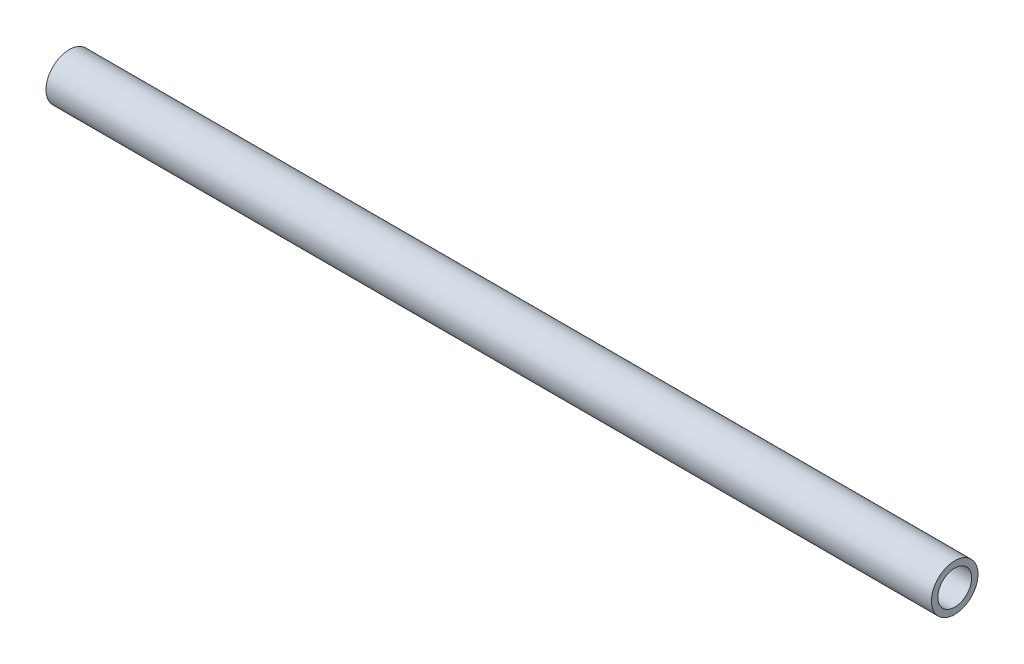
ISO-10303-21;
HEADER;
FILE_DESCRIPTION(('STEP AP214'),'2;1');
FILE_NAME('part.step','',(''),(''),'','','');
FILE_SCHEMA(('AUTOMOTIVE_DESIGN { 1 0 10303 214 1 1 1 1 }'));
ENDSEC;
DATA;
#1=APPLICATION_CONTEXT('core data for automotive mechanical design processes');
#2=APPLICATION_PROTOCOL_DEFINITION('international standard','automotive_design',2000,#1);
#3=PRODUCT_CONTEXT('',#1,'mechanical');
#4=PRODUCT('Part','Part','',(#3));
#5=PRODUCT_RELATED_PRODUCT_CATEGORY('part','',(#4));
#6=PRODUCT_DEFINITION_FORMATION('','',#4);
#7=PRODUCT_DEFINITION_CONTEXT('part definition',#1,'design');
#8=PRODUCT_DEFINITION('design','',#6,#7);
#9=PRODUCT_DEFINITION_SHAPE('','',#8);
#10=(LENGTH_UNIT() NAMED_UNIT(*) SI_UNIT(.MILLI.,.METRE.));
#11=(NAMED_UNIT(*) PLANE_ANGLE_UNIT() SI_UNIT($,.RADIAN.));
#12=(NAMED_UNIT(*) SI_UNIT($,.STERADIAN.) SOLID_ANGLE_UNIT());
#13=UNCERTAINTY_MEASURE_WITH_UNIT(LENGTH_MEASURE(1.E-05),#10,'distance_accuracy_value','');
#14=(GEOMETRIC_REPRESENTATION_CONTEXT(3) GLOBAL_UNCERTAINTY_ASSIGNED_CONTEXT((#13)) GLOBAL_UNIT_ASSIGNED_CONTEXT((#10,
#11,#12)) REPRESENTATION_CONTEXT('',''));
#15=CARTESIAN_POINT('',(0.,0.,0.));
#16=DIRECTION('',(0.,0.,1.));
#17=DIRECTION('',(1.,0.,0.));
#18=AXIS2_PLACEMENT_3D('',#15,#16,#17);
#19=CARTESIAN_POINT('',(500.,0.,0.));
#20=DIRECTION('',(1.,0.,0.));
#21=DIRECTION('',(0.,0.,-1.));
#22=AXIS2_PLACEMENT_3D('',#19,#20,#21);
#23=PLANE('',#22);
#24=CARTESIAN_POINT('',(500.,0.,0.));
#25=DIRECTION('',(1.,0.,0.));
#26=DIRECTION('',(0.,0.,-1.));
#27=AXIS2_PLACEMENT_3D('',#24,#25,#26);
#28=CIRCLE('',#27,13.15);
#29=CARTESIAN_POINT('',(500.,0.,-13.15));
#30=VERTEX_POINT('',#29);
#31=EDGE_CURVE('E10',#30,#30,#28,.T.);
#32=ORIENTED_EDGE('',*,*,#31,.T.);
#33=EDGE_LOOP('',(#32));
#34=FACE_BOUND('',#33,.T.);
#35=CARTESIAN_POINT('',(500.,0.,0.));
#36=DIRECTION('',(1.,0.,0.));
#37=DIRECTION('',(0.,0.,-1.));
#38=AXIS2_PLACEMENT_3D('',#35,#36,#37);
#39=CIRCLE('',#38,9.55);
#40=CARTESIAN_POINT('',(500.,0.,-9.55));
#41=VERTEX_POINT('',#40);
#42=EDGE_CURVE('E44',#41,#41,#39,.T.);
#43=ORIENTED_EDGE('',*,*,#42,.F.);
#44=EDGE_LOOP('',(#43));
#45=FACE_BOUND('',#44,.T.);
#46=ADVANCED_FACE('F33',(#34,#45),#23,.T.);
#47=CARTESIAN_POINT('',(0.,0.,0.));
#48=DIRECTION('',(1.,0.,0.));
#49=DIRECTION('',(0.,0.,-1.));
#50=AXIS2_PLACEMENT_3D('',#47,#48,#49);
#51=PLANE('',#50);
#52=CARTESIAN_POINT('',(0.,0.,0.));
#53=DIRECTION('',(1.,0.,0.));
#54=DIRECTION('',(0.,0.,-1.));
#55=AXIS2_PLACEMENT_3D('',#52,#53,#54);
#56=CIRCLE('',#55,13.15);
#57=CARTESIAN_POINT('',(0.,0.,-13.15));
#58=VERTEX_POINT('',#57);
#59=EDGE_CURVE('E37',#58,#58,#56,.T.);
#60=ORIENTED_EDGE('',*,*,#59,.F.);
#61=EDGE_LOOP('',(#60));
#62=FACE_BOUND('',#61,.T.);
#63=CARTESIAN_POINT('',(0.,0.,0.));
#64=DIRECTION('',(1.,0.,0.));
#65=DIRECTION('',(0.,0.,-1.));
#66=AXIS2_PLACEMENT_3D('',#63,#64,#65);
#67=CIRCLE('',#66,9.55);
#68=CARTESIAN_POINT('',(0.,0.,-9.55));
#69=VERTEX_POINT('',#68);
#70=EDGE_CURVE('E46',#69,#69,#67,.T.);
#71=ORIENTED_EDGE('',*,*,#70,.T.);
#72=EDGE_LOOP('',(#71));
#73=FACE_BOUND('',#72,.T.);
#74=ADVANCED_FACE('F56',(#62,#73),#51,.F.);
#75=CARTESIAN_POINT('',(500.,0.,0.));
#76=DIRECTION('',(-1.,0.,0.));
#77=DIRECTION('',(0.,0.,1.));
#78=AXIS2_PLACEMENT_3D('',#75,#76,#77);
#79=CYLINDRICAL_SURFACE('',#78,13.15);
#80=ORIENTED_EDGE('',*,*,#31,.F.);
#81=EDGE_LOOP('',(#80));
#82=FACE_BOUND('',#81,.T.);
#83=ORIENTED_EDGE('',*,*,#59,.T.);
#84=EDGE_LOOP('',(#83));
#85=FACE_BOUND('',#84,.T.);
#86=ADVANCED_FACE('F35',(#82,#85),#79,.T.);
#87=CARTESIAN_POINT('',(500.,0.,0.));
#88=DIRECTION('',(-1.,0.,0.));
#89=DIRECTION('',(0.,0.,1.));
#90=AXIS2_PLACEMENT_3D('',#87,#88,#89);
#91=CYLINDRICAL_SURFACE('',#90,9.55);
#92=ORIENTED_EDGE('',*,*,#42,.T.);
#93=EDGE_LOOP('',(#92));
#94=FACE_BOUND('',#93,.T.);
#95=ORIENTED_EDGE('',*,*,#70,.F.);
#96=EDGE_LOOP('',(#95));
#97=FACE_BOUND('',#96,.T.);
#98=ADVANCED_FACE('F52',(#94,#97),#91,.F.);
#99=CLOSED_SHELL('',(#46,#74,#86,#98));
#100=MANIFOLD_SOLID_BREP('B2',#99);
#101=ADVANCED_BREP_SHAPE_REPRESENTATION('',(#18,#100),#14);
#102=SHAPE_DEFINITION_REPRESENTATION(#9,#101);
ENDSEC;
END-ISO-10303-21;
